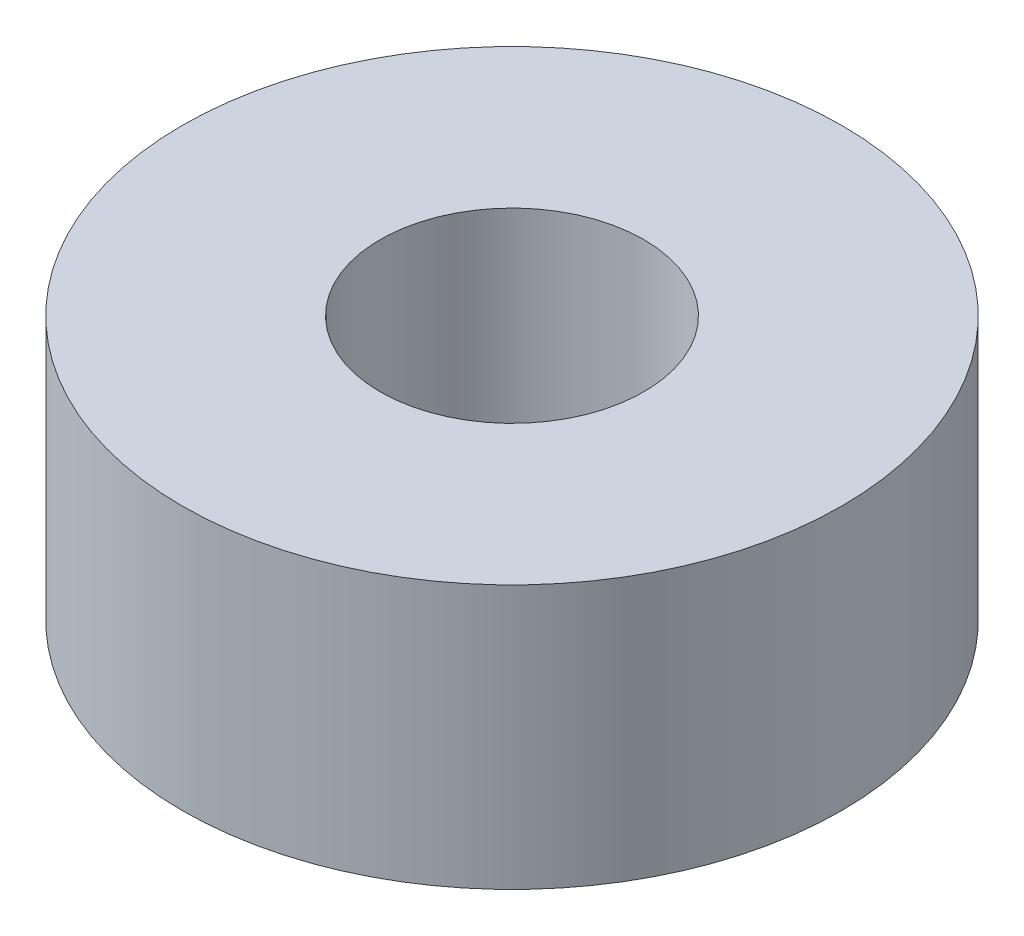
ISO-10303-21;
HEADER;
FILE_DESCRIPTION(('STEP AP214'),'2;1');
FILE_NAME('part.step','',(''),(''),'','','');
FILE_SCHEMA(('AUTOMOTIVE_DESIGN { 1 0 10303 214 1 1 1 1 }'));
ENDSEC;
DATA;
#1=APPLICATION_CONTEXT('core data for automotive mechanical design processes');
#2=APPLICATION_PROTOCOL_DEFINITION('international standard','automotive_design',2000,#1);
#3=PRODUCT_CONTEXT('',#1,'mechanical');
#4=PRODUCT('Part','Part','',(#3));
#5=PRODUCT_RELATED_PRODUCT_CATEGORY('part','',(#4));
#6=PRODUCT_DEFINITION_FORMATION('','',#4);
#7=PRODUCT_DEFINITION_CONTEXT('part definition',#1,'design');
#8=PRODUCT_DEFINITION('design','',#6,#7);
#9=PRODUCT_DEFINITION_SHAPE('','',#8);
#10=(LENGTH_UNIT() NAMED_UNIT(*) SI_UNIT(.MILLI.,.METRE.));
#11=(NAMED_UNIT(*) PLANE_ANGLE_UNIT() SI_UNIT($,.RADIAN.));
#12=(NAMED_UNIT(*) SI_UNIT($,.STERADIAN.) SOLID_ANGLE_UNIT());
#13=UNCERTAINTY_MEASURE_WITH_UNIT(LENGTH_MEASURE(1.E-05),#10,'distance_accuracy_value','');
#14=(GEOMETRIC_REPRESENTATION_CONTEXT(3) GLOBAL_UNCERTAINTY_ASSIGNED_CONTEXT((#13)) GLOBAL_UNIT_ASSIGNED_CONTEXT((#10,
#11,#12)) REPRESENTATION_CONTEXT('',''));
#15=CARTESIAN_POINT('',(0.,0.,0.));
#16=DIRECTION('',(0.,0.,1.));
#17=DIRECTION('',(1.,0.,0.));
#18=AXIS2_PLACEMENT_3D('',#15,#16,#17);
#19=CARTESIAN_POINT('',(0.,4.,0.));
#20=DIRECTION('',(0.,1.,0.));
#21=DIRECTION('',(0.,0.,1.));
#22=AXIS2_PLACEMENT_3D('',#19,#20,#21);
#23=PLANE('',#22);
#24=CARTESIAN_POINT('',(0.,4.,0.));
#25=DIRECTION('',(0.,1.,0.));
#26=DIRECTION('',(0.,0.,1.));
#27=AXIS2_PLACEMENT_3D('',#24,#25,#26);
#28=CIRCLE('',#27,5.);
#29=CARTESIAN_POINT('',(0.,4.,5.));
#30=VERTEX_POINT('',#29);
#31=EDGE_CURVE('E10',#30,#30,#28,.T.);
#32=ORIENTED_EDGE('',*,*,#31,.T.);
#33=EDGE_LOOP('',(#32));
#34=FACE_BOUND('',#33,.T.);
#35=CARTESIAN_POINT('',(0.,4.,0.));
#36=DIRECTION('',(0.,1.,0.));
#37=DIRECTION('',(0.,0.,1.));
#38=AXIS2_PLACEMENT_3D('',#35,#36,#37);
#39=CIRCLE('',#38,2.);
#40=CARTESIAN_POINT('',(0.,4.,2.));
#41=VERTEX_POINT('',#40);
#42=EDGE_CURVE('E48',#41,#41,#39,.T.);
#43=ORIENTED_EDGE('',*,*,#42,.F.);
#44=EDGE_LOOP('',(#43));
#45=FACE_BOUND('',#44,.T.);
#46=ADVANCED_FACE('F37',(#34,#45),#23,.T.);
#47=CARTESIAN_POINT('',(0.,0.,0.));
#48=DIRECTION('',(0.,1.,0.));
#49=DIRECTION('',(0.,0.,1.));
#50=AXIS2_PLACEMENT_3D('',#47,#48,#49);
#51=PLANE('',#50);
#52=CARTESIAN_POINT('',(0.,0.,0.));
#53=DIRECTION('',(0.,1.,0.));
#54=DIRECTION('',(0.,0.,1.));
#55=AXIS2_PLACEMENT_3D('',#52,#53,#54);
#56=CIRCLE('',#55,5.);
#57=CARTESIAN_POINT('',(0.,0.,5.));
#58=VERTEX_POINT('',#57);
#59=EDGE_CURVE('E41',#58,#58,#56,.T.);
#60=ORIENTED_EDGE('',*,*,#59,.F.);
#61=EDGE_LOOP('',(#60));
#62=FACE_BOUND('',#61,.T.);
#63=CARTESIAN_POINT('',(0.,0.,0.));
#64=DIRECTION('',(0.,1.,0.));
#65=DIRECTION('',(0.,0.,1.));
#66=AXIS2_PLACEMENT_3D('',#63,#64,#65);
#67=CIRCLE('',#66,2.);
#68=CARTESIAN_POINT('',(0.,0.,2.));
#69=VERTEX_POINT('',#68);
#70=EDGE_CURVE('E50',#69,#69,#67,.T.);
#71=ORIENTED_EDGE('',*,*,#70,.T.);
#72=EDGE_LOOP('',(#71));
#73=FACE_BOUND('',#72,.T.);
#74=ADVANCED_FACE('F60',(#62,#73),#51,.F.);
#75=CARTESIAN_POINT('',(0.,4.,0.));
#76=DIRECTION('',(0.,-1.,0.));
#77=DIRECTION('',(0.,0.,-1.));
#78=AXIS2_PLACEMENT_3D('',#75,#76,#77);
#79=CYLINDRICAL_SURFACE('',#78,5.);
#80=ORIENTED_EDGE('',*,*,#31,.F.);
#81=EDGE_LOOP('',(#80));
#82=FACE_BOUND('',#81,.T.);
#83=ORIENTED_EDGE('',*,*,#59,.T.);
#84=EDGE_LOOP('',(#83));
#85=FACE_BOUND('',#84,.T.);
#86=ADVANCED_FACE('F39',(#82,#85),#79,.T.);
#87=CARTESIAN_POINT('',(0.,4.,0.));
#88=DIRECTION('',(0.,-1.,0.));
#89=DIRECTION('',(0.,0.,-1.));
#90=AXIS2_PLACEMENT_3D('',#87,#88,#89);
#91=CYLINDRICAL_SURFACE('',#90,2.);
#92=ORIENTED_EDGE('',*,*,#42,.T.);
#93=EDGE_LOOP('',(#92));
#94=FACE_BOUND('',#93,.T.);
#95=ORIENTED_EDGE('',*,*,#70,.F.);
#96=EDGE_LOOP('',(#95));
#97=FACE_BOUND('',#96,.T.);
#98=ADVANCED_FACE('F56',(#94,#97),#91,.F.);
#99=CLOSED_SHELL('',(#46,#74,#86,#98));
#100=MANIFOLD_SOLID_BREP('B2',#99);
#101=ADVANCED_BREP_SHAPE_REPRESENTATION('',(#18,#100),#14);
#102=SHAPE_DEFINITION_REPRESENTATION(#9,#101);
ENDSEC;
END-ISO-10303-21;
